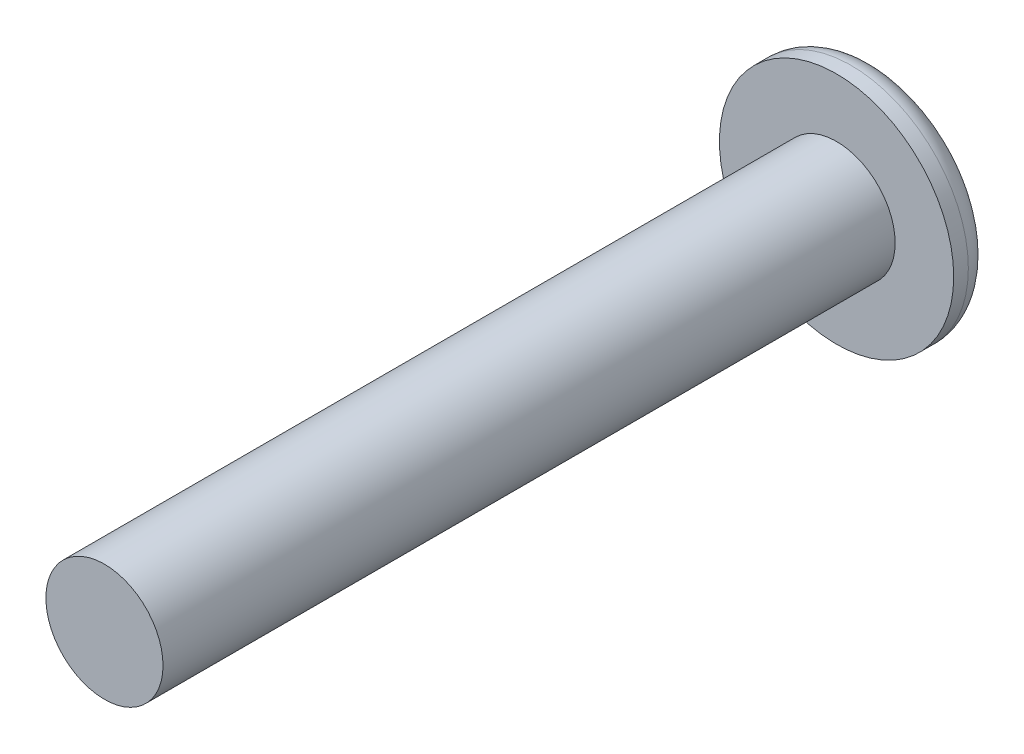
ISO-10303-21;
HEADER;
FILE_DESCRIPTION(('STEP AP214'),'2;1');
FILE_NAME('part.step','',(''),(''),'','','');
FILE_SCHEMA(('AUTOMOTIVE_DESIGN { 1 0 10303 214 1 1 1 1 }'));
ENDSEC;
DATA;
#1=APPLICATION_CONTEXT('core data for automotive mechanical design processes');
#2=APPLICATION_PROTOCOL_DEFINITION('international standard','automotive_design',2000,#1);
#3=PRODUCT_CONTEXT('',#1,'mechanical');
#4=PRODUCT('Part','Part','',(#3));
#5=PRODUCT_RELATED_PRODUCT_CATEGORY('part','',(#4));
#6=PRODUCT_DEFINITION_FORMATION('','',#4);
#7=PRODUCT_DEFINITION_CONTEXT('part definition',#1,'design');
#8=PRODUCT_DEFINITION('design','',#6,#7);
#9=PRODUCT_DEFINITION_SHAPE('','',#8);
#10=(LENGTH_UNIT() NAMED_UNIT(*) SI_UNIT(.MILLI.,.METRE.));
#11=(NAMED_UNIT(*) PLANE_ANGLE_UNIT() SI_UNIT($,.RADIAN.));
#12=(NAMED_UNIT(*) SI_UNIT($,.STERADIAN.) SOLID_ANGLE_UNIT());
#13=UNCERTAINTY_MEASURE_WITH_UNIT(LENGTH_MEASURE(1.E-05),#10,'distance_accuracy_value','');
#14=(GEOMETRIC_REPRESENTATION_CONTEXT(3) GLOBAL_UNCERTAINTY_ASSIGNED_CONTEXT((#13)) GLOBAL_UNIT_ASSIGNED_CONTEXT((#10,
#11,#12)) REPRESENTATION_CONTEXT('',''));
#15=CARTESIAN_POINT('',(0.,0.,0.));
#16=DIRECTION('',(0.,0.,1.));
#17=DIRECTION('',(1.,0.,0.));
#18=AXIS2_PLACEMENT_3D('',#15,#16,#17);
#19=CARTESIAN_POINT('',(0.,0.,1.3));
#20=DIRECTION('',(0.,0.,1.));
#21=DIRECTION('',(1.,0.,0.));
#22=AXIS2_PLACEMENT_3D('',#19,#20,#21);
#23=PLANE('',#22);
#24=CARTESIAN_POINT('',(0.,0.,1.3));
#25=DIRECTION('',(0.,0.,1.));
#26=DIRECTION('',(1.,0.,0.));
#27=AXIS2_PLACEMENT_3D('',#24,#25,#26);
#28=CIRCLE('',#27,4.);
#29=CARTESIAN_POINT('',(4.,0.,1.3));
#30=VERTEX_POINT('',#29);
#31=EDGE_CURVE('E149',#30,#30,#28,.T.);
#32=ORIENTED_EDGE('',*,*,#31,.T.);
#33=EDGE_LOOP('',(#32));
#34=FACE_BOUND('',#33,.T.);
#35=CARTESIAN_POINT('',(0.,0.,1.3));
#36=DIRECTION('',(0.,0.,1.));
#37=DIRECTION('',(1.,0.,0.));
#38=AXIS2_PLACEMENT_3D('',#35,#36,#37);
#39=CIRCLE('',#38,2.);
#40=CARTESIAN_POINT('',(2.,0.,1.3));
#41=VERTEX_POINT('',#40);
#42=EDGE_CURVE('E140',#41,#41,#39,.T.);
#43=ORIENTED_EDGE('',*,*,#42,.F.);
#44=EDGE_LOOP('',(#43));
#45=FACE_BOUND('',#44,.T.);
#46=ADVANCED_FACE('F38',(#34,#45),#23,.T.);
#47=CARTESIAN_POINT('',(0.,0.,1.3));
#48=DIRECTION('',(0.,0.,-1.));
#49=DIRECTION('',(-1.,0.,0.));
#50=AXIS2_PLACEMENT_3D('',#47,#48,#49);
#51=CYLINDRICAL_SURFACE('',#50,4.);
#52=CARTESIAN_POINT('',(0.,0.,0.8));
#53=DIRECTION('',(0.,0.,1.));
#54=DIRECTION('',(1.,0.,0.));
#55=AXIS2_PLACEMENT_3D('',#52,#53,#54);
#56=CIRCLE('',#55,4.);
#57=CARTESIAN_POINT('',(4.,0.,0.8));
#58=VERTEX_POINT('',#57);
#59=EDGE_CURVE('E46',#58,#58,#56,.T.);
#60=ORIENTED_EDGE('',*,*,#59,.T.);
#61=EDGE_LOOP('',(#60));
#62=FACE_BOUND('',#61,.T.);
#63=ORIENTED_EDGE('',*,*,#31,.F.);
#64=EDGE_LOOP('',(#63));
#65=FACE_BOUND('',#64,.T.);
#66=ADVANCED_FACE('F156',(#62,#65),#51,.T.);
#67=CARTESIAN_POINT('',(0.,0.,0.));
#68=DIRECTION('',(0.,0.,1.));
#69=DIRECTION('',(1.,0.,0.));
#70=AXIS2_PLACEMENT_3D('',#67,#68,#69);
#71=PLANE('',#70);
#72=CARTESIAN_POINT('',(0.,0.,0.));
#73=DIRECTION('',(0.,0.,1.));
#74=DIRECTION('',(1.,0.,0.));
#75=AXIS2_PLACEMENT_3D('',#72,#73,#74);
#76=CIRCLE('',#75,3.2);
#77=CARTESIAN_POINT('',(3.2,0.,0.));
#78=VERTEX_POINT('',#77);
#79=EDGE_CURVE('E11',#78,#78,#76,.F.);
#80=ORIENTED_EDGE('',*,*,#79,.T.);
#81=EDGE_LOOP('',(#80));
#82=FACE_BOUND('',#81,.T.);
#83=DIRECTION('',(0.5,-0.866025403784439,0.));
#84=VECTOR('',#83,1.);
#85=CARTESIAN_POINT('',(0.721687836487032,1.25,0.));
#86=LINE('',#85,#84);
#87=CARTESIAN_POINT('',(0.721687836487032,1.25,0.));
#88=VERTEX_POINT('',#87);
#89=CARTESIAN_POINT('',(1.44337567297406,0.,0.));
#90=VERTEX_POINT('',#89);
#91=EDGE_CURVE('E127',#88,#90,#86,.T.);
#92=ORIENTED_EDGE('',*,*,#91,.F.);
#93=DIRECTION('',(1.,0.,0.));
#94=VECTOR('',#93,1.);
#95=CARTESIAN_POINT('',(-0.721687836487033,1.25,0.));
#96=LINE('',#95,#94);
#97=CARTESIAN_POINT('',(-0.721687836487033,1.25,0.));
#98=VERTEX_POINT('',#97);
#99=EDGE_CURVE('E53',#98,#88,#96,.T.);
#100=ORIENTED_EDGE('',*,*,#99,.F.);
#101=DIRECTION('',(0.5,0.866025403784439,0.));
#102=VECTOR('',#101,1.);
#103=CARTESIAN_POINT('',(-1.44337567297407,0.,0.));
#104=LINE('',#103,#102);
#105=CARTESIAN_POINT('',(-1.44337567297407,0.,0.));
#106=VERTEX_POINT('',#105);
#107=EDGE_CURVE('E136',#106,#98,#104,.T.);
#108=ORIENTED_EDGE('',*,*,#107,.F.);
#109=DIRECTION('',(-0.5,0.866025403784439,0.));
#110=VECTOR('',#109,1.);
#111=CARTESIAN_POINT('',(-0.721687836487032,-1.25,0.));
#112=LINE('',#111,#110);
#113=CARTESIAN_POINT('',(-0.721687836487032,-1.25,0.));
#114=VERTEX_POINT('',#113);
#115=EDGE_CURVE('E134',#114,#106,#112,.T.);
#116=ORIENTED_EDGE('',*,*,#115,.F.);
#117=DIRECTION('',(-1.,0.,0.));
#118=VECTOR('',#117,1.);
#119=CARTESIAN_POINT('',(0.721687836487032,-1.25,0.));
#120=LINE('',#119,#118);
#121=CARTESIAN_POINT('',(0.721687836487032,-1.25,0.));
#122=VERTEX_POINT('',#121);
#123=EDGE_CURVE('E101',#122,#114,#120,.T.);
#124=ORIENTED_EDGE('',*,*,#123,.F.);
#125=DIRECTION('',(-0.5,-0.866025403784439,0.));
#126=VECTOR('',#125,1.);
#127=CARTESIAN_POINT('',(1.44337567297406,0.,0.));
#128=LINE('',#127,#126);
#129=EDGE_CURVE('E130',#90,#122,#128,.T.);
#130=ORIENTED_EDGE('',*,*,#129,.F.);
#131=EDGE_LOOP('',(#92,#100,#108,#116,#124,#130));
#132=FACE_BOUND('',#131,.T.);
#133=ADVANCED_FACE('F173',(#82,#132),#71,.F.);
#134=CARTESIAN_POINT('',(0.,0.,26.3));
#135=DIRECTION('',(0.,0.,-1.));
#136=DIRECTION('',(-1.,0.,0.));
#137=AXIS2_PLACEMENT_3D('',#134,#135,#136);
#138=CYLINDRICAL_SURFACE('',#137,2.);
#139=CARTESIAN_POINT('',(0.,0.,26.3));
#140=DIRECTION('',(0.,0.,1.));
#141=DIRECTION('',(1.,0.,0.));
#142=AXIS2_PLACEMENT_3D('',#139,#140,#141);
#143=CIRCLE('',#142,2.);
#144=CARTESIAN_POINT('',(2.,0.,26.3));
#145=VERTEX_POINT('',#144);
#146=EDGE_CURVE('E146',#145,#145,#143,.T.);
#147=ORIENTED_EDGE('',*,*,#146,.F.);
#148=EDGE_LOOP('',(#147));
#149=FACE_BOUND('',#148,.T.);
#150=ORIENTED_EDGE('',*,*,#42,.T.);
#151=EDGE_LOOP('',(#150));
#152=FACE_BOUND('',#151,.T.);
#153=ADVANCED_FACE('F177',(#149,#152),#138,.T.);
#154=CARTESIAN_POINT('',(0.,0.,26.3));
#155=DIRECTION('',(0.,0.,1.));
#156=DIRECTION('',(1.,0.,0.));
#157=AXIS2_PLACEMENT_3D('',#154,#155,#156);
#158=PLANE('',#157);
#159=ORIENTED_EDGE('',*,*,#146,.T.);
#160=EDGE_LOOP('',(#159));
#161=FACE_BOUND('',#160,.T.);
#162=ADVANCED_FACE('F184',(#161),#158,.T.);
#163=CARTESIAN_POINT('',(-0.721687836487033,1.25,1.2));
#164=DIRECTION('',(0.,1.,0.));
#165=DIRECTION('',(-1.,0.,0.));
#166=AXIS2_PLACEMENT_3D('',#163,#164,#165);
#167=PLANE('',#166);
#168=ORIENTED_EDGE('',*,*,#99,.T.);
#169=DIRECTION('',(0.,0.,-1.));
#170=VECTOR('',#169,1.);
#171=CARTESIAN_POINT('',(0.721687836487032,1.25,1.2));
#172=LINE('',#171,#170);
#173=CARTESIAN_POINT('',(0.721687836487032,1.25,1.2));
#174=VERTEX_POINT('',#173);
#175=EDGE_CURVE('E83',#174,#88,#172,.T.);
#176=ORIENTED_EDGE('',*,*,#175,.F.);
#177=DIRECTION('',(1.,0.,0.));
#178=VECTOR('',#177,1.);
#179=CARTESIAN_POINT('',(-0.721687836487033,1.25,1.2));
#180=LINE('',#179,#178);
#181=CARTESIAN_POINT('',(-0.721687836487033,1.25,1.2));
#182=VERTEX_POINT('',#181);
#183=EDGE_CURVE('E138',#182,#174,#180,.T.);
#184=ORIENTED_EDGE('',*,*,#183,.F.);
#185=DIRECTION('',(0.,0.,-1.));
#186=VECTOR('',#185,1.);
#187=CARTESIAN_POINT('',(-0.721687836487033,1.25,1.2));
#188=LINE('',#187,#186);
#189=EDGE_CURVE('E61',#182,#98,#188,.T.);
#190=ORIENTED_EDGE('',*,*,#189,.T.);
#191=EDGE_LOOP('',(#168,#176,#184,#190));
#192=FACE_BOUND('',#191,.T.);
#193=ADVANCED_FACE('F192',(#192),#167,.F.);
#194=CARTESIAN_POINT('',(-1.44337567297407,0.,1.2));
#195=DIRECTION('',(-0.866025403784439,0.5,0.));
#196=DIRECTION('',(-0.5,-0.866025403784439,0.));
#197=AXIS2_PLACEMENT_3D('',#194,#195,#196);
#198=PLANE('',#197);
#199=ORIENTED_EDGE('',*,*,#107,.T.);
#200=ORIENTED_EDGE('',*,*,#189,.F.);
#201=DIRECTION('',(0.5,0.866025403784439,0.));
#202=VECTOR('',#201,1.);
#203=CARTESIAN_POINT('',(-1.44337567297407,0.,1.2));
#204=LINE('',#203,#202);
#205=CARTESIAN_POINT('',(-1.44337567297407,0.,1.2));
#206=VERTEX_POINT('',#205);
#207=EDGE_CURVE('E113',#206,#182,#204,.T.);
#208=ORIENTED_EDGE('',*,*,#207,.F.);
#209=DIRECTION('',(0.,0.,-1.));
#210=VECTOR('',#209,1.);
#211=CARTESIAN_POINT('',(-1.44337567297407,0.,1.2));
#212=LINE('',#211,#210);
#213=EDGE_CURVE('E105',#206,#106,#212,.T.);
#214=ORIENTED_EDGE('',*,*,#213,.T.);
#215=EDGE_LOOP('',(#199,#200,#208,#214));
#216=FACE_BOUND('',#215,.T.);
#217=ADVANCED_FACE('F194',(#216),#198,.F.);
#218=CARTESIAN_POINT('',(-0.721687836487032,-1.25,1.2));
#219=DIRECTION('',(-0.866025403784439,-0.5,0.));
#220=DIRECTION('',(0.5,-0.866025403784439,0.));
#221=AXIS2_PLACEMENT_3D('',#218,#219,#220);
#222=PLANE('',#221);
#223=ORIENTED_EDGE('',*,*,#115,.T.);
#224=ORIENTED_EDGE('',*,*,#213,.F.);
#225=DIRECTION('',(-0.5,0.866025403784439,0.));
#226=VECTOR('',#225,1.);
#227=CARTESIAN_POINT('',(-0.721687836487032,-1.25,1.2));
#228=LINE('',#227,#226);
#229=CARTESIAN_POINT('',(-0.721687836487032,-1.25,1.2));
#230=VERTEX_POINT('',#229);
#231=EDGE_CURVE('E109',#230,#206,#228,.T.);
#232=ORIENTED_EDGE('',*,*,#231,.F.);
#233=DIRECTION('',(0.,0.,-1.));
#234=VECTOR('',#233,1.);
#235=CARTESIAN_POINT('',(-0.721687836487032,-1.25,1.2));
#236=LINE('',#235,#234);
#237=EDGE_CURVE('E94',#230,#114,#236,.T.);
#238=ORIENTED_EDGE('',*,*,#237,.T.);
#239=EDGE_LOOP('',(#223,#224,#232,#238));
#240=FACE_BOUND('',#239,.T.);
#241=ADVANCED_FACE('F110',(#240),#222,.F.);
#242=CARTESIAN_POINT('',(0.721687836487032,-1.25,1.2));
#243=DIRECTION('',(0.,-1.,0.));
#244=DIRECTION('',(1.,0.,0.));
#245=AXIS2_PLACEMENT_3D('',#242,#243,#244);
#246=PLANE('',#245);
#247=ORIENTED_EDGE('',*,*,#123,.T.);
#248=ORIENTED_EDGE('',*,*,#237,.F.);
#249=DIRECTION('',(-1.,0.,0.));
#250=VECTOR('',#249,1.);
#251=CARTESIAN_POINT('',(0.721687836487032,-1.25,1.2));
#252=LINE('',#251,#250);
#253=CARTESIAN_POINT('',(0.721687836487032,-1.25,1.2));
#254=VERTEX_POINT('',#253);
#255=EDGE_CURVE('E98',#254,#230,#252,.T.);
#256=ORIENTED_EDGE('',*,*,#255,.F.);
#257=DIRECTION('',(0.,0.,-1.));
#258=VECTOR('',#257,1.);
#259=CARTESIAN_POINT('',(0.721687836487032,-1.25,1.2));
#260=LINE('',#259,#258);
#261=EDGE_CURVE('E106',#254,#122,#260,.T.);
#262=ORIENTED_EDGE('',*,*,#261,.T.);
#263=EDGE_LOOP('',(#247,#248,#256,#262));
#264=FACE_BOUND('',#263,.T.);
#265=ADVANCED_FACE('F96',(#264),#246,.F.);
#266=CARTESIAN_POINT('',(1.44337567297406,0.,1.2));
#267=DIRECTION('',(0.866025403784439,-0.5,0.));
#268=DIRECTION('',(0.5,0.866025403784439,0.));
#269=AXIS2_PLACEMENT_3D('',#266,#267,#268);
#270=PLANE('',#269);
#271=ORIENTED_EDGE('',*,*,#129,.T.);
#272=ORIENTED_EDGE('',*,*,#261,.F.);
#273=DIRECTION('',(-0.5,-0.866025403784439,0.));
#274=VECTOR('',#273,1.);
#275=CARTESIAN_POINT('',(1.44337567297406,0.,1.2));
#276=LINE('',#275,#274);
#277=CARTESIAN_POINT('',(1.44337567297406,0.,1.2));
#278=VERTEX_POINT('',#277);
#279=EDGE_CURVE('E119',#278,#254,#276,.T.);
#280=ORIENTED_EDGE('',*,*,#279,.F.);
#281=DIRECTION('',(0.,0.,-1.));
#282=VECTOR('',#281,1.);
#283=CARTESIAN_POINT('',(1.44337567297406,0.,1.2));
#284=LINE('',#283,#282);
#285=EDGE_CURVE('E143',#278,#90,#284,.T.);
#286=ORIENTED_EDGE('',*,*,#285,.T.);
#287=EDGE_LOOP('',(#271,#272,#280,#286));
#288=FACE_BOUND('',#287,.T.);
#289=ADVANCED_FACE('F205',(#288),#270,.F.);
#290=CARTESIAN_POINT('',(0.721687836487032,1.25,1.2));
#291=DIRECTION('',(0.866025403784439,0.5,0.));
#292=DIRECTION('',(-0.5,0.866025403784439,0.));
#293=AXIS2_PLACEMENT_3D('',#290,#291,#292);
#294=PLANE('',#293);
#295=ORIENTED_EDGE('',*,*,#91,.T.);
#296=ORIENTED_EDGE('',*,*,#285,.F.);
#297=DIRECTION('',(0.5,-0.866025403784439,0.));
#298=VECTOR('',#297,1.);
#299=CARTESIAN_POINT('',(0.721687836487032,1.25,1.2));
#300=LINE('',#299,#298);
#301=EDGE_CURVE('E121',#174,#278,#300,.T.);
#302=ORIENTED_EDGE('',*,*,#301,.F.);
#303=ORIENTED_EDGE('',*,*,#175,.T.);
#304=EDGE_LOOP('',(#295,#296,#302,#303));
#305=FACE_BOUND('',#304,.T.);
#306=ADVANCED_FACE('F164',(#305),#294,.F.);
#307=CARTESIAN_POINT('',(0.,0.,1.2));
#308=DIRECTION('',(0.,0.,-1.));
#309=DIRECTION('',(-1.,0.,0.));
#310=AXIS2_PLACEMENT_3D('',#307,#308,#309);
#311=PLANE('',#310);
#312=ORIENTED_EDGE('',*,*,#183,.T.);
#313=ORIENTED_EDGE('',*,*,#301,.T.);
#314=ORIENTED_EDGE('',*,*,#279,.T.);
#315=ORIENTED_EDGE('',*,*,#255,.T.);
#316=ORIENTED_EDGE('',*,*,#231,.T.);
#317=ORIENTED_EDGE('',*,*,#207,.T.);
#318=EDGE_LOOP('',(#312,#313,#314,#315,#316,#317));
#319=FACE_BOUND('',#318,.T.);
#320=ADVANCED_FACE('F116',(#319),#311,.T.);
#321=CARTESIAN_POINT('',(0.,0.,0.8));
#322=DIRECTION('',(0.,0.,1.));
#323=DIRECTION('',(1.,0.,0.));
#324=AXIS2_PLACEMENT_3D('',#321,#322,#323);
#325=TOROIDAL_SURFACE('',#324,3.2,0.8);
#326=ORIENTED_EDGE('',*,*,#79,.F.);
#327=EDGE_LOOP('',(#326));
#328=FACE_BOUND('',#327,.T.);
#329=ORIENTED_EDGE('',*,*,#59,.F.);
#330=EDGE_LOOP('',(#329));
#331=FACE_BOUND('',#330,.T.);
#332=ADVANCED_FACE('F40',(#328,#331),#325,.T.);
#333=CLOSED_SHELL('',(#46,#66,#133,#153,#162,#193,#217,#241,#265,#289,#306,#320,#332));
#334=MANIFOLD_SOLID_BREP('B2',#333);
#335=ADVANCED_BREP_SHAPE_REPRESENTATION('',(#18,#334),#14);
#336=SHAPE_DEFINITION_REPRESENTATION(#9,#335);
ENDSEC;
END-ISO-10303-21;
